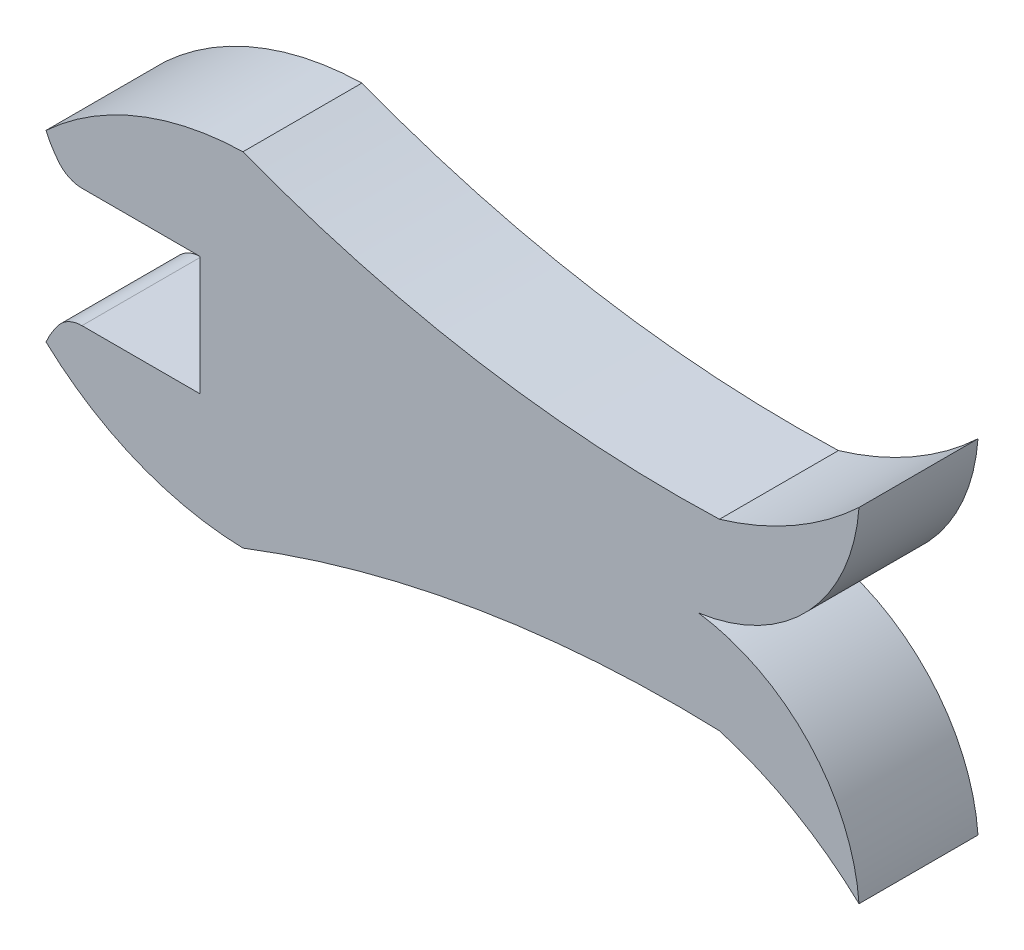
ISO-10303-21;
HEADER;
FILE_DESCRIPTION(('STEP AP214'),'2;1');
FILE_NAME('part.step','',(''),(''),'','','');
FILE_SCHEMA(('AUTOMOTIVE_DESIGN { 1 0 10303 214 1 1 1 1 }'));
ENDSEC;
DATA;
#1=APPLICATION_CONTEXT('core data for automotive mechanical design processes');
#2=APPLICATION_PROTOCOL_DEFINITION('international standard','automotive_design',2000,#1);
#3=PRODUCT_CONTEXT('',#1,'mechanical');
#4=PRODUCT('Part','Part','',(#3));
#5=PRODUCT_RELATED_PRODUCT_CATEGORY('part','',(#4));
#6=PRODUCT_DEFINITION_FORMATION('','',#4);
#7=PRODUCT_DEFINITION_CONTEXT('part definition',#1,'design');
#8=PRODUCT_DEFINITION('design','',#6,#7);
#9=PRODUCT_DEFINITION_SHAPE('','',#8);
#10=(LENGTH_UNIT() NAMED_UNIT(*) SI_UNIT(.MILLI.,.METRE.));
#11=(NAMED_UNIT(*) PLANE_ANGLE_UNIT() SI_UNIT($,.RADIAN.));
#12=(NAMED_UNIT(*) SI_UNIT($,.STERADIAN.) SOLID_ANGLE_UNIT());
#13=UNCERTAINTY_MEASURE_WITH_UNIT(LENGTH_MEASURE(1.E-05),#10,'distance_accuracy_value','');
#14=(GEOMETRIC_REPRESENTATION_CONTEXT(3) GLOBAL_UNCERTAINTY_ASSIGNED_CONTEXT((#13)) GLOBAL_UNIT_ASSIGNED_CONTEXT((#10,
#11,#12)) REPRESENTATION_CONTEXT('',''));
#15=CARTESIAN_POINT('',(0.,0.,0.));
#16=DIRECTION('',(0.,0.,1.));
#17=DIRECTION('',(1.,0.,0.));
#18=AXIS2_PLACEMENT_3D('',#15,#16,#17);
#19=CARTESIAN_POINT('',(121.523623664008,-1.52400000000001,1.524));
#20=DIRECTION('',(0.,-1.,0.));
#21=DIRECTION('',(0.,0.,-1.));
#22=AXIS2_PLACEMENT_3D('',#19,#20,#21);
#23=PLANE('',#22);
#24=DIRECTION('',(-1.,0.,0.));
#25=VECTOR('',#24,1.);
#26=CARTESIAN_POINT('',(121.523623664008,-1.52400000000001,0.));
#27=LINE('',#26,#25);
#28=CARTESIAN_POINT('',(121.523623664008,-1.52400000000001,0.));
#29=VERTEX_POINT('',#28);
#30=CARTESIAN_POINT('',(120.011557410036,-1.52400000000001,0.));
#31=VERTEX_POINT('',#30);
#32=EDGE_CURVE('E172',#29,#31,#27,.T.);
#33=ORIENTED_EDGE('',*,*,#32,.T.);
#34=DIRECTION('',(0.,0.,-1.));
#35=VECTOR('',#34,1.);
#36=CARTESIAN_POINT('',(120.011557410036,-1.52400000000001,1.524));
#37=LINE('',#36,#35);
#38=CARTESIAN_POINT('',(120.011557410036,-1.52400000000001,1.524));
#39=VERTEX_POINT('',#38);
#40=EDGE_CURVE('E11',#39,#31,#37,.T.);
#41=ORIENTED_EDGE('',*,*,#40,.F.);
#42=DIRECTION('',(-1.,0.,0.));
#43=VECTOR('',#42,1.);
#44=CARTESIAN_POINT('',(121.523623664008,-1.52400000000001,1.524));
#45=LINE('',#44,#43);
#46=CARTESIAN_POINT('',(121.523623664008,-1.52400000000001,1.524));
#47=VERTEX_POINT('',#46);
#48=EDGE_CURVE('E200',#47,#39,#45,.T.);
#49=ORIENTED_EDGE('',*,*,#48,.F.);
#50=DIRECTION('',(0.,0.,-1.));
#51=VECTOR('',#50,1.);
#52=CARTESIAN_POINT('',(121.523623664008,-1.52400000000001,1.524));
#53=LINE('',#52,#51);
#54=EDGE_CURVE('E168',#47,#29,#53,.T.);
#55=ORIENTED_EDGE('',*,*,#54,.T.);
#56=EDGE_LOOP('',(#33,#41,#49,#55));
#57=FACE_BOUND('',#56,.T.);
#58=ADVANCED_FACE('F34',(#57),#23,.F.);
#59=CARTESIAN_POINT('',(120.011557410036,-1.90500000000001,1.524));
#60=DIRECTION('',(0.,0.,-1.));
#61=DIRECTION('',(-1.,0.,0.));
#62=AXIS2_PLACEMENT_3D('',#59,#60,#61);
#63=CYLINDRICAL_SURFACE('',#62,0.381000000000003);
#64=CARTESIAN_POINT('',(120.011557410036,-1.90500000000001,0.));
#65=DIRECTION('',(0.,0.,1.));
#66=DIRECTION('',(-1.,0.,0.));
#67=AXIS2_PLACEMENT_3D('',#64,#65,#66);
#68=CIRCLE('',#67,0.381000000000003);
#69=CARTESIAN_POINT('',(119.715874960142,-1.66472330777986,0.));
#70=VERTEX_POINT('',#69);
#71=EDGE_CURVE('E175',#31,#70,#68,.T.);
#72=ORIENTED_EDGE('',*,*,#71,.T.);
#73=DIRECTION('',(0.,0.,-1.));
#74=VECTOR('',#73,1.);
#75=CARTESIAN_POINT('',(119.715874960142,-1.66472330777986,1.524));
#76=LINE('',#75,#74);
#77=CARTESIAN_POINT('',(119.715874960142,-1.66472330777986,1.524));
#78=VERTEX_POINT('',#77);
#79=EDGE_CURVE('E42',#78,#70,#76,.T.);
#80=ORIENTED_EDGE('',*,*,#79,.F.);
#81=CARTESIAN_POINT('',(120.011557410036,-1.90500000000001,1.524));
#82=DIRECTION('',(0.,0.,1.));
#83=DIRECTION('',(-1.,0.,0.));
#84=AXIS2_PLACEMENT_3D('',#81,#82,#83);
#85=CIRCLE('',#84,0.381000000000003);
#86=EDGE_CURVE('E114',#39,#78,#85,.T.);
#87=ORIENTED_EDGE('',*,*,#86,.F.);
#88=ORIENTED_EDGE('',*,*,#40,.T.);
#89=EDGE_LOOP('',(#72,#80,#87,#88));
#90=FACE_BOUND('',#89,.T.);
#91=ADVANCED_FACE('F293',(#90),#63,.T.);
#92=CARTESIAN_POINT('',(120.627687133934,-2.40567771046065,1.524));
#93=DIRECTION('',(0.,0.,-1.));
#94=DIRECTION('',(-1.,0.,0.));
#95=AXIS2_PLACEMENT_3D('',#92,#93,#94);
#96=CYLINDRICAL_SURFACE('',#95,1.17491057835408);
#97=CARTESIAN_POINT('',(120.627687133934,-2.40567771046065,0.));
#98=DIRECTION('',(0.,0.,1.));
#99=DIRECTION('',(1.,0.,0.));
#100=AXIS2_PLACEMENT_3D('',#97,#98,#99);
#101=CIRCLE('',#100,1.17491057835408);
#102=CARTESIAN_POINT('',(119.550930957899,-1.93555963539893,0.));
#103=VERTEX_POINT('',#102);
#104=EDGE_CURVE('E177',#70,#103,#101,.T.);
#105=ORIENTED_EDGE('',*,*,#104,.T.);
#106=DIRECTION('',(0.,0.,-1.));
#107=VECTOR('',#106,1.);
#108=CARTESIAN_POINT('',(119.550930957899,-1.93555963539893,1.524));
#109=LINE('',#108,#107);
#110=CARTESIAN_POINT('',(119.550930957899,-1.93555963539893,1.524));
#111=VERTEX_POINT('',#110);
#112=EDGE_CURVE('E228',#111,#103,#109,.T.);
#113=ORIENTED_EDGE('',*,*,#112,.F.);
#114=CARTESIAN_POINT('',(120.627687133934,-2.40567771046065,1.524));
#115=DIRECTION('',(0.,0.,1.));
#116=DIRECTION('',(1.,0.,0.));
#117=AXIS2_PLACEMENT_3D('',#114,#115,#116);
#118=CIRCLE('',#117,1.17491057835408);
#119=EDGE_CURVE('E236',#78,#111,#118,.T.);
#120=ORIENTED_EDGE('',*,*,#119,.F.);
#121=ORIENTED_EDGE('',*,*,#79,.T.);
#122=EDGE_LOOP('',(#105,#113,#120,#121));
#123=FACE_BOUND('',#122,.T.);
#124=ADVANCED_FACE('F234',(#123),#96,.T.);
#125=CARTESIAN_POINT('',(122.165352320788,0.882990716447061,1.524));
#126=DIRECTION('',(0.,0.,-1.));
#127=DIRECTION('',(-1.,0.,0.));
#128=AXIS2_PLACEMENT_3D('',#125,#126,#127);
#129=CYLINDRICAL_SURFACE('',#128,3.84440179333778);
#130=CARTESIAN_POINT('',(122.165352320788,0.882990716447061,0.));
#131=DIRECTION('',(0.,0.,1.));
#132=DIRECTION('',(1.,0.,0.));
#133=AXIS2_PLACEMENT_3D('',#130,#131,#132);
#134=CIRCLE('',#133,3.84440179333778);
#135=CARTESIAN_POINT('',(122.074126099719,-2.96032854237183,0.));
#136=VERTEX_POINT('',#135);
#137=EDGE_CURVE('E179',#103,#136,#134,.T.);
#138=ORIENTED_EDGE('',*,*,#137,.T.);
#139=DIRECTION('',(0.,0.,-1.));
#140=VECTOR('',#139,1.);
#141=CARTESIAN_POINT('',(122.074126099719,-2.96032854237183,1.524));
#142=LINE('',#141,#140);
#143=CARTESIAN_POINT('',(122.074126099719,-2.96032854237183,1.524));
#144=VERTEX_POINT('',#143);
#145=EDGE_CURVE('E225',#144,#136,#142,.T.);
#146=ORIENTED_EDGE('',*,*,#145,.F.);
#147=CARTESIAN_POINT('',(122.165352320788,0.882990716447061,1.524));
#148=DIRECTION('',(0.,0.,1.));
#149=DIRECTION('',(1.,0.,0.));
#150=AXIS2_PLACEMENT_3D('',#147,#148,#149);
#151=CIRCLE('',#150,3.84440179333778);
#152=EDGE_CURVE('E254',#111,#144,#151,.T.);
#153=ORIENTED_EDGE('',*,*,#152,.F.);
#154=ORIENTED_EDGE('',*,*,#112,.T.);
#155=EDGE_LOOP('',(#138,#146,#153,#154));
#156=FACE_BOUND('',#155,.T.);
#157=ADVANCED_FACE('F245',(#156),#129,.T.);
#158=CARTESIAN_POINT('',(127.632217658602,-17.3755732685195,1.524));
#159=DIRECTION('',(0.,0.,-1.));
#160=DIRECTION('',(-1.,0.,0.));
#161=AXIS2_PLACEMENT_3D('',#158,#159,#160);
#162=CYLINDRICAL_SURFACE('',#161,15.449649261121);
#163=CARTESIAN_POINT('',(127.632217658602,-17.3755732685195,0.));
#164=DIRECTION('',(0.,0.,-1.));
#165=DIRECTION('',(-1.,0.,0.));
#166=AXIS2_PLACEMENT_3D('',#163,#164,#165);
#167=CIRCLE('',#166,15.449649261121);
#168=CARTESIAN_POINT('',(128.177782779105,-1.93555963539893,0.));
#169=VERTEX_POINT('',#168);
#170=EDGE_CURVE('E181',#136,#169,#167,.T.);
#171=ORIENTED_EDGE('',*,*,#170,.T.);
#172=DIRECTION('',(0.,0.,-1.));
#173=VECTOR('',#172,1.);
#174=CARTESIAN_POINT('',(128.177782779105,-1.93555963539893,1.524));
#175=LINE('',#174,#173);
#176=CARTESIAN_POINT('',(128.177782779105,-1.93555963539893,1.524));
#177=VERTEX_POINT('',#176);
#178=EDGE_CURVE('E222',#177,#169,#175,.T.);
#179=ORIENTED_EDGE('',*,*,#178,.F.);
#180=CARTESIAN_POINT('',(127.632217658602,-17.3755732685195,1.524));
#181=DIRECTION('',(0.,0.,-1.));
#182=DIRECTION('',(-1.,0.,0.));
#183=AXIS2_PLACEMENT_3D('',#180,#181,#182);
#184=CIRCLE('',#183,15.449649261121);
#185=EDGE_CURVE('E251',#144,#177,#184,.T.);
#186=ORIENTED_EDGE('',*,*,#185,.F.);
#187=ORIENTED_EDGE('',*,*,#145,.T.);
#188=EDGE_LOOP('',(#171,#179,#186,#187));
#189=FACE_BOUND('',#188,.T.);
#190=ADVANCED_FACE('F249',(#189),#162,.F.);
#191=CARTESIAN_POINT('',(126.908248236988,-6.220880829802,1.524));
#192=DIRECTION('',(0.,0.,-1.));
#193=DIRECTION('',(-1.,0.,0.));
#194=AXIS2_PLACEMENT_3D('',#191,#192,#193);
#195=CYLINDRICAL_SURFACE('',#194,4.46941782482083);
#196=CARTESIAN_POINT('',(126.908248236988,-6.220880829802,0.));
#197=DIRECTION('',(0.,0.,-1.));
#198=DIRECTION('',(-1.,0.,0.));
#199=AXIS2_PLACEMENT_3D('',#196,#197,#198);
#200=CIRCLE('',#199,4.46941782482083);
#201=CARTESIAN_POINT('',(129.965124824906,-2.96032854237183,0.));
#202=VERTEX_POINT('',#201);
#203=EDGE_CURVE('E183',#169,#202,#200,.T.);
#204=ORIENTED_EDGE('',*,*,#203,.T.);
#205=DIRECTION('',(0.,0.,-1.));
#206=VECTOR('',#205,1.);
#207=CARTESIAN_POINT('',(129.965124824906,-2.96032854237183,1.524));
#208=LINE('',#207,#206);
#209=CARTESIAN_POINT('',(129.965124824906,-2.96032854237183,1.524));
#210=VERTEX_POINT('',#209);
#211=EDGE_CURVE('E219',#210,#202,#208,.T.);
#212=ORIENTED_EDGE('',*,*,#211,.F.);
#213=CARTESIAN_POINT('',(126.908248236988,-6.220880829802,1.524));
#214=DIRECTION('',(0.,0.,-1.));
#215=DIRECTION('',(-1.,0.,0.));
#216=AXIS2_PLACEMENT_3D('',#213,#214,#215);
#217=CIRCLE('',#216,4.46941782482083);
#218=EDGE_CURVE('E253',#177,#210,#217,.T.);
#219=ORIENTED_EDGE('',*,*,#218,.F.);
#220=ORIENTED_EDGE('',*,*,#178,.T.);
#221=EDGE_LOOP('',(#204,#212,#219,#220));
#222=FACE_BOUND('',#221,.T.);
#223=ADVANCED_FACE('F306',(#222),#195,.F.);
#224=CARTESIAN_POINT('',(127.574848435007,-3.1352658743737,1.524));
#225=DIRECTION('',(0.,0.,-1.));
#226=DIRECTION('',(-1.,0.,0.));
#227=AXIS2_PLACEMENT_3D('',#224,#225,#226);
#228=CYLINDRICAL_SURFACE('',#227,2.39666941613567);
#229=CARTESIAN_POINT('',(127.574848435007,-3.1352658743737,0.));
#230=DIRECTION('',(0.,0.,1.));
#231=DIRECTION('',(1.,0.,0.));
#232=AXIS2_PLACEMENT_3D('',#229,#230,#231);
#233=CIRCLE('',#232,2.39666941613567);
#234=CARTESIAN_POINT('',(127.90896425291,-0.762000000000015,0.));
#235=VERTEX_POINT('',#234);
#236=EDGE_CURVE('E185',#202,#235,#233,.T.);
#237=ORIENTED_EDGE('',*,*,#236,.T.);
#238=DIRECTION('',(0.,0.,-1.));
#239=VECTOR('',#238,1.);
#240=CARTESIAN_POINT('',(127.90896425291,-0.762000000000015,1.524));
#241=LINE('',#240,#239);
#242=CARTESIAN_POINT('',(127.90896425291,-0.762000000000015,1.524));
#243=VERTEX_POINT('',#242);
#244=EDGE_CURVE('E216',#243,#235,#241,.T.);
#245=ORIENTED_EDGE('',*,*,#244,.F.);
#246=CARTESIAN_POINT('',(127.574848435007,-3.1352658743737,1.524));
#247=DIRECTION('',(0.,0.,1.));
#248=DIRECTION('',(1.,0.,0.));
#249=AXIS2_PLACEMENT_3D('',#246,#247,#248);
#250=CIRCLE('',#249,2.39666941613567);
#251=EDGE_CURVE('E256',#210,#243,#250,.T.);
#252=ORIENTED_EDGE('',*,*,#251,.F.);
#253=ORIENTED_EDGE('',*,*,#211,.T.);
#254=EDGE_LOOP('',(#237,#245,#252,#253));
#255=FACE_BOUND('',#254,.T.);
#256=ADVANCED_FACE('F309',(#255),#228,.T.);
#257=CARTESIAN_POINT('',(127.574848435007,1.61126587437368,1.524));
#258=DIRECTION('',(0.,0.,-1.));
#259=DIRECTION('',(-1.,0.,0.));
#260=AXIS2_PLACEMENT_3D('',#257,#258,#259);
#261=CYLINDRICAL_SURFACE('',#260,2.39666941613567);
#262=CARTESIAN_POINT('',(127.574848435007,1.61126587437368,0.));
#263=DIRECTION('',(0.,0.,1.));
#264=DIRECTION('',(-1.,0.,0.));
#265=AXIS2_PLACEMENT_3D('',#262,#263,#264);
#266=CIRCLE('',#265,2.39666941613567);
#267=CARTESIAN_POINT('',(129.965124824906,1.4363285423718,0.));
#268=VERTEX_POINT('',#267);
#269=EDGE_CURVE('E187',#235,#268,#266,.T.);
#270=ORIENTED_EDGE('',*,*,#269,.T.);
#271=DIRECTION('',(0.,0.,-1.));
#272=VECTOR('',#271,1.);
#273=CARTESIAN_POINT('',(129.965124824906,1.4363285423718,1.524));
#274=LINE('',#273,#272);
#275=CARTESIAN_POINT('',(129.965124824906,1.4363285423718,1.524));
#276=VERTEX_POINT('',#275);
#277=EDGE_CURVE('E213',#276,#268,#274,.T.);
#278=ORIENTED_EDGE('',*,*,#277,.F.);
#279=CARTESIAN_POINT('',(127.574848435007,1.61126587437368,1.524));
#280=DIRECTION('',(0.,0.,1.));
#281=DIRECTION('',(-1.,0.,0.));
#282=AXIS2_PLACEMENT_3D('',#279,#280,#281);
#283=CIRCLE('',#282,2.39666941613567);
#284=EDGE_CURVE('E262',#243,#276,#283,.T.);
#285=ORIENTED_EDGE('',*,*,#284,.F.);
#286=ORIENTED_EDGE('',*,*,#244,.T.);
#287=EDGE_LOOP('',(#270,#278,#285,#286));
#288=FACE_BOUND('',#287,.T.);
#289=ADVANCED_FACE('F313',(#288),#261,.T.);
#290=CARTESIAN_POINT('',(126.908248236988,4.69688082980198,1.524));
#291=DIRECTION('',(0.,0.,-1.));
#292=DIRECTION('',(-1.,0.,0.));
#293=AXIS2_PLACEMENT_3D('',#290,#291,#292);
#294=CYLINDRICAL_SURFACE('',#293,4.46941782482083);
#295=CARTESIAN_POINT('',(126.908248236988,4.69688082980198,0.));
#296=DIRECTION('',(0.,0.,-1.));
#297=DIRECTION('',(1.,0.,0.));
#298=AXIS2_PLACEMENT_3D('',#295,#296,#297);
#299=CIRCLE('',#298,4.46941782482083);
#300=CARTESIAN_POINT('',(128.177782779105,0.411559635398913,0.));
#301=VERTEX_POINT('',#300);
#302=EDGE_CURVE('E189',#268,#301,#299,.T.);
#303=ORIENTED_EDGE('',*,*,#302,.T.);
#304=DIRECTION('',(0.,0.,-1.));
#305=VECTOR('',#304,1.);
#306=CARTESIAN_POINT('',(128.177782779105,0.411559635398913,1.524));
#307=LINE('',#306,#305);
#308=CARTESIAN_POINT('',(128.177782779105,0.411559635398913,1.524));
#309=VERTEX_POINT('',#308);
#310=EDGE_CURVE('E210',#309,#301,#307,.T.);
#311=ORIENTED_EDGE('',*,*,#310,.F.);
#312=CARTESIAN_POINT('',(126.908248236988,4.69688082980198,1.524));
#313=DIRECTION('',(0.,0.,-1.));
#314=DIRECTION('',(1.,0.,0.));
#315=AXIS2_PLACEMENT_3D('',#312,#313,#314);
#316=CIRCLE('',#315,4.46941782482083);
#317=EDGE_CURVE('E264',#276,#309,#316,.T.);
#318=ORIENTED_EDGE('',*,*,#317,.F.);
#319=ORIENTED_EDGE('',*,*,#277,.T.);
#320=EDGE_LOOP('',(#303,#311,#318,#319));
#321=FACE_BOUND('',#320,.T.);
#322=ADVANCED_FACE('F317',(#321),#294,.F.);
#323=CARTESIAN_POINT('',(127.632217658602,15.8515732685195,1.524));
#324=DIRECTION('',(0.,0.,-1.));
#325=DIRECTION('',(-1.,0.,0.));
#326=AXIS2_PLACEMENT_3D('',#323,#324,#325);
#327=CYLINDRICAL_SURFACE('',#326,15.449649261121);
#328=CARTESIAN_POINT('',(127.632217658602,15.8515732685195,0.));
#329=DIRECTION('',(0.,0.,-1.));
#330=DIRECTION('',(1.,0.,0.));
#331=AXIS2_PLACEMENT_3D('',#328,#329,#330);
#332=CIRCLE('',#331,15.449649261121);
#333=CARTESIAN_POINT('',(122.074126099719,1.43632854237181,0.));
#334=VERTEX_POINT('',#333);
#335=EDGE_CURVE('E191',#301,#334,#332,.T.);
#336=ORIENTED_EDGE('',*,*,#335,.T.);
#337=DIRECTION('',(0.,0.,-1.));
#338=VECTOR('',#337,1.);
#339=CARTESIAN_POINT('',(122.074126099719,1.43632854237181,1.524));
#340=LINE('',#339,#338);
#341=CARTESIAN_POINT('',(122.074126099719,1.43632854237181,1.524));
#342=VERTEX_POINT('',#341);
#343=EDGE_CURVE('E207',#342,#334,#340,.T.);
#344=ORIENTED_EDGE('',*,*,#343,.F.);
#345=CARTESIAN_POINT('',(127.632217658602,15.8515732685195,1.524));
#346=DIRECTION('',(0.,0.,-1.));
#347=DIRECTION('',(1.,0.,0.));
#348=AXIS2_PLACEMENT_3D('',#345,#346,#347);
#349=CIRCLE('',#348,15.449649261121);
#350=EDGE_CURVE('E266',#309,#342,#349,.T.);
#351=ORIENTED_EDGE('',*,*,#350,.F.);
#352=ORIENTED_EDGE('',*,*,#310,.T.);
#353=EDGE_LOOP('',(#336,#344,#351,#352));
#354=FACE_BOUND('',#353,.T.);
#355=ADVANCED_FACE('F321',(#354),#327,.F.);
#356=CARTESIAN_POINT('',(122.165352320788,-2.40699071644708,1.524));
#357=DIRECTION('',(0.,0.,-1.));
#358=DIRECTION('',(-1.,0.,0.));
#359=AXIS2_PLACEMENT_3D('',#356,#357,#358);
#360=CYLINDRICAL_SURFACE('',#359,3.84440179333778);
#361=CARTESIAN_POINT('',(122.165352320788,-2.40699071644708,0.));
#362=DIRECTION('',(0.,0.,1.));
#363=DIRECTION('',(-1.,0.,0.));
#364=AXIS2_PLACEMENT_3D('',#361,#362,#363);
#365=CIRCLE('',#364,3.84440179333778);
#366=CARTESIAN_POINT('',(119.550930957899,0.411559635398909,0.));
#367=VERTEX_POINT('',#366);
#368=EDGE_CURVE('E193',#334,#367,#365,.T.);
#369=ORIENTED_EDGE('',*,*,#368,.T.);
#370=DIRECTION('',(0.,0.,-1.));
#371=VECTOR('',#370,1.);
#372=CARTESIAN_POINT('',(119.550930957899,0.411559635398909,1.524));
#373=LINE('',#372,#371);
#374=CARTESIAN_POINT('',(119.550930957899,0.411559635398909,1.524));
#375=VERTEX_POINT('',#374);
#376=EDGE_CURVE('E204',#375,#367,#373,.T.);
#377=ORIENTED_EDGE('',*,*,#376,.F.);
#378=CARTESIAN_POINT('',(122.165352320788,-2.40699071644708,1.524));
#379=DIRECTION('',(0.,0.,1.));
#380=DIRECTION('',(-1.,0.,0.));
#381=AXIS2_PLACEMENT_3D('',#378,#379,#380);
#382=CIRCLE('',#381,3.84440179333778);
#383=EDGE_CURVE('E268',#342,#375,#382,.T.);
#384=ORIENTED_EDGE('',*,*,#383,.F.);
#385=ORIENTED_EDGE('',*,*,#343,.T.);
#386=EDGE_LOOP('',(#369,#377,#384,#385));
#387=FACE_BOUND('',#386,.T.);
#388=ADVANCED_FACE('F274',(#387),#360,.T.);
#389=CARTESIAN_POINT('',(120.627687133934,0.881677710460631,1.524));
#390=DIRECTION('',(0.,0.,-1.));
#391=DIRECTION('',(-1.,0.,0.));
#392=AXIS2_PLACEMENT_3D('',#389,#390,#391);
#393=CYLINDRICAL_SURFACE('',#392,1.17491057835408);
#394=CARTESIAN_POINT('',(120.627687133934,0.881677710460631,0.));
#395=DIRECTION('',(0.,0.,1.));
#396=DIRECTION('',(-1.,0.,0.));
#397=AXIS2_PLACEMENT_3D('',#394,#395,#396);
#398=CIRCLE('',#397,1.17491057835408);
#399=CARTESIAN_POINT('',(119.715874960142,0.14072330777984,0.));
#400=VERTEX_POINT('',#399);
#401=EDGE_CURVE('E195',#367,#400,#398,.T.);
#402=ORIENTED_EDGE('',*,*,#401,.T.);
#403=DIRECTION('',(0.,0.,-1.));
#404=VECTOR('',#403,1.);
#405=CARTESIAN_POINT('',(119.715874960142,0.14072330777984,1.524));
#406=LINE('',#405,#404);
#407=CARTESIAN_POINT('',(119.715874960142,0.14072330777984,1.524));
#408=VERTEX_POINT('',#407);
#409=EDGE_CURVE('E163',#408,#400,#406,.T.);
#410=ORIENTED_EDGE('',*,*,#409,.F.);
#411=CARTESIAN_POINT('',(120.627687133934,0.881677710460631,1.524));
#412=DIRECTION('',(0.,0.,1.));
#413=DIRECTION('',(-1.,0.,0.));
#414=AXIS2_PLACEMENT_3D('',#411,#412,#413);
#415=CIRCLE('',#414,1.17491057835408);
#416=EDGE_CURVE('E154',#375,#408,#415,.T.);
#417=ORIENTED_EDGE('',*,*,#416,.F.);
#418=ORIENTED_EDGE('',*,*,#376,.T.);
#419=EDGE_LOOP('',(#402,#410,#417,#418));
#420=FACE_BOUND('',#419,.T.);
#421=ADVANCED_FACE('F278',(#420),#393,.T.);
#422=CARTESIAN_POINT('',(120.011557410036,0.38099999999999,1.524));
#423=DIRECTION('',(0.,0.,-1.));
#424=DIRECTION('',(-1.,0.,0.));
#425=AXIS2_PLACEMENT_3D('',#422,#423,#424);
#426=CYLINDRICAL_SURFACE('',#425,0.381000000000003);
#427=CARTESIAN_POINT('',(120.011557410036,0.38099999999999,0.));
#428=DIRECTION('',(0.,0.,1.));
#429=DIRECTION('',(-1.,0.,0.));
#430=AXIS2_PLACEMENT_3D('',#427,#428,#429);
#431=CIRCLE('',#430,0.381000000000003);
#432=CARTESIAN_POINT('',(120.011557410036,0.,0.));
#433=VERTEX_POINT('',#432);
#434=EDGE_CURVE('E162',#400,#433,#431,.T.);
#435=ORIENTED_EDGE('',*,*,#434,.T.);
#436=DIRECTION('',(0.,0.,-1.));
#437=VECTOR('',#436,1.);
#438=CARTESIAN_POINT('',(120.011557410036,0.,1.524));
#439=LINE('',#438,#437);
#440=CARTESIAN_POINT('',(120.011557410036,0.,1.524));
#441=VERTEX_POINT('',#440);
#442=EDGE_CURVE('E159',#441,#433,#439,.T.);
#443=ORIENTED_EDGE('',*,*,#442,.F.);
#444=CARTESIAN_POINT('',(120.011557410036,0.38099999999999,1.524));
#445=DIRECTION('',(0.,0.,1.));
#446=DIRECTION('',(-1.,0.,0.));
#447=AXIS2_PLACEMENT_3D('',#444,#445,#446);
#448=CIRCLE('',#447,0.381000000000003);
#449=EDGE_CURVE('E148',#408,#441,#448,.T.);
#450=ORIENTED_EDGE('',*,*,#449,.F.);
#451=ORIENTED_EDGE('',*,*,#409,.T.);
#452=EDGE_LOOP('',(#435,#443,#450,#451));
#453=FACE_BOUND('',#452,.T.);
#454=ADVANCED_FACE('F160',(#453),#426,.T.);
#455=CARTESIAN_POINT('',(121.523623664008,0.,1.524));
#456=DIRECTION('',(0.,1.,0.));
#457=DIRECTION('',(-1.,0.,0.));
#458=AXIS2_PLACEMENT_3D('',#455,#456,#457);
#459=PLANE('',#458);
#460=DIRECTION('',(1.,0.,0.));
#461=VECTOR('',#460,1.);
#462=CARTESIAN_POINT('',(121.523623664008,0.,0.));
#463=LINE('',#462,#461);
#464=CARTESIAN_POINT('',(121.523623664008,0.,0.));
#465=VERTEX_POINT('',#464);
#466=EDGE_CURVE('E100',#433,#465,#463,.T.);
#467=ORIENTED_EDGE('',*,*,#466,.T.);
#468=DIRECTION('',(0.,0.,-1.));
#469=VECTOR('',#468,1.);
#470=CARTESIAN_POINT('',(121.523623664008,0.,1.524));
#471=LINE('',#470,#469);
#472=CARTESIAN_POINT('',(121.523623664008,0.,1.524));
#473=VERTEX_POINT('',#472);
#474=EDGE_CURVE('E164',#473,#465,#471,.T.);
#475=ORIENTED_EDGE('',*,*,#474,.F.);
#476=DIRECTION('',(1.,0.,0.));
#477=VECTOR('',#476,1.);
#478=CARTESIAN_POINT('',(121.523623664008,0.,1.524));
#479=LINE('',#478,#477);
#480=EDGE_CURVE('E152',#441,#473,#479,.T.);
#481=ORIENTED_EDGE('',*,*,#480,.F.);
#482=ORIENTED_EDGE('',*,*,#442,.T.);
#483=EDGE_LOOP('',(#467,#475,#481,#482));
#484=FACE_BOUND('',#483,.T.);
#485=ADVANCED_FACE('F166',(#484),#459,.F.);
#486=CARTESIAN_POINT('',(121.523623664008,-1.52400000000001,1.524));
#487=DIRECTION('',(1.,0.,0.));
#488=DIRECTION('',(0.,0.,-1.));
#489=AXIS2_PLACEMENT_3D('',#486,#487,#488);
#490=PLANE('',#489);
#491=DIRECTION('',(0.,-1.,0.));
#492=VECTOR('',#491,1.);
#493=CARTESIAN_POINT('',(121.523623664008,-1.52400000000001,0.));
#494=LINE('',#493,#492);
#495=EDGE_CURVE('E106',#465,#29,#494,.T.);
#496=ORIENTED_EDGE('',*,*,#495,.T.);
#497=ORIENTED_EDGE('',*,*,#54,.F.);
#498=DIRECTION('',(0.,-1.,0.));
#499=VECTOR('',#498,1.);
#500=CARTESIAN_POINT('',(121.523623664008,-1.52400000000001,1.524));
#501=LINE('',#500,#499);
#502=EDGE_CURVE('E50',#473,#47,#501,.T.);
#503=ORIENTED_EDGE('',*,*,#502,.F.);
#504=ORIENTED_EDGE('',*,*,#474,.T.);
#505=EDGE_LOOP('',(#496,#497,#503,#504));
#506=FACE_BOUND('',#505,.T.);
#507=ADVANCED_FACE('F282',(#506),#490,.F.);
#508=CARTESIAN_POINT('',(120.011557410036,-1.90500000000001,1.524));
#509=DIRECTION('',(0.,0.,-1.));
#510=DIRECTION('',(-1.,0.,0.));
#511=AXIS2_PLACEMENT_3D('',#508,#509,#510);
#512=PLANE('',#511);
#513=ORIENTED_EDGE('',*,*,#48,.T.);
#514=ORIENTED_EDGE('',*,*,#86,.T.);
#515=ORIENTED_EDGE('',*,*,#119,.T.);
#516=ORIENTED_EDGE('',*,*,#152,.T.);
#517=ORIENTED_EDGE('',*,*,#185,.T.);
#518=ORIENTED_EDGE('',*,*,#218,.T.);
#519=ORIENTED_EDGE('',*,*,#251,.T.);
#520=ORIENTED_EDGE('',*,*,#284,.T.);
#521=ORIENTED_EDGE('',*,*,#317,.T.);
#522=ORIENTED_EDGE('',*,*,#350,.T.);
#523=ORIENTED_EDGE('',*,*,#383,.T.);
#524=ORIENTED_EDGE('',*,*,#416,.T.);
#525=ORIENTED_EDGE('',*,*,#449,.T.);
#526=ORIENTED_EDGE('',*,*,#480,.T.);
#527=ORIENTED_EDGE('',*,*,#502,.T.);
#528=EDGE_LOOP('',(#513,#514,#515,#516,#517,#518,#519,#520,#521,#522,#523,#524,#525,#526,#527));
#529=FACE_BOUND('',#528,.T.);
#530=ADVANCED_FACE('F150',(#529),#512,.F.);
#531=CARTESIAN_POINT('',(120.011557410036,-1.90500000000001,0.));
#532=DIRECTION('',(0.,0.,-1.));
#533=DIRECTION('',(-1.,0.,0.));
#534=AXIS2_PLACEMENT_3D('',#531,#532,#533);
#535=PLANE('',#534);
#536=ORIENTED_EDGE('',*,*,#32,.F.);
#537=ORIENTED_EDGE('',*,*,#495,.F.);
#538=ORIENTED_EDGE('',*,*,#466,.F.);
#539=ORIENTED_EDGE('',*,*,#434,.F.);
#540=ORIENTED_EDGE('',*,*,#401,.F.);
#541=ORIENTED_EDGE('',*,*,#368,.F.);
#542=ORIENTED_EDGE('',*,*,#335,.F.);
#543=ORIENTED_EDGE('',*,*,#302,.F.);
#544=ORIENTED_EDGE('',*,*,#269,.F.);
#545=ORIENTED_EDGE('',*,*,#236,.F.);
#546=ORIENTED_EDGE('',*,*,#203,.F.);
#547=ORIENTED_EDGE('',*,*,#170,.F.);
#548=ORIENTED_EDGE('',*,*,#137,.F.);
#549=ORIENTED_EDGE('',*,*,#104,.F.);
#550=ORIENTED_EDGE('',*,*,#71,.F.);
#551=EDGE_LOOP('',(#536,#537,#538,#539,#540,#541,#542,#543,#544,#545,#546,#547,#548,#549,#550));
#552=FACE_BOUND('',#551,.T.);
#553=ADVANCED_FACE('F240',(#552),#535,.T.);
#554=CLOSED_SHELL('',(#58,#91,#124,#157,#190,#223,#256,#289,#322,#355,#388,#421,#454,#485,#507,
#530,#553));
#555=MANIFOLD_SOLID_BREP('B2',#554);
#556=ADVANCED_BREP_SHAPE_REPRESENTATION('',(#18,#555),#14);
#557=SHAPE_DEFINITION_REPRESENTATION(#9,#556);
ENDSEC;
END-ISO-10303-21;
